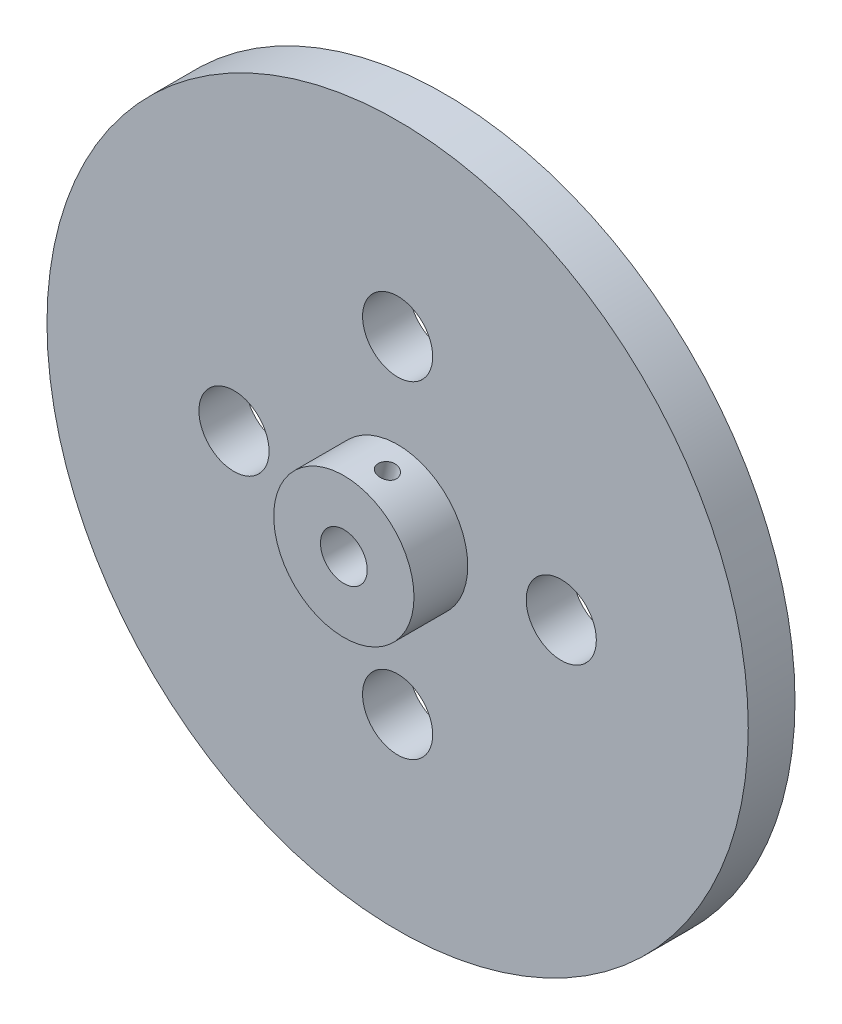
ISO-10303-21;
HEADER;
FILE_DESCRIPTION(('STEP AP214'),'2;1');
FILE_NAME('part.step','',(''),(''),'','','');
FILE_SCHEMA(('AUTOMOTIVE_DESIGN { 1 0 10303 214 1 1 1 1 }'));
ENDSEC;
DATA;
#1=APPLICATION_CONTEXT('core data for automotive mechanical design processes');
#2=APPLICATION_PROTOCOL_DEFINITION('international standard','automotive_design',2000,#1);
#3=PRODUCT_CONTEXT('',#1,'mechanical');
#4=PRODUCT('Part','Part','',(#3));
#5=PRODUCT_RELATED_PRODUCT_CATEGORY('part','',(#4));
#6=PRODUCT_DEFINITION_FORMATION('','',#4);
#7=PRODUCT_DEFINITION_CONTEXT('part definition',#1,'design');
#8=PRODUCT_DEFINITION('design','',#6,#7);
#9=PRODUCT_DEFINITION_SHAPE('','',#8);
#10=(LENGTH_UNIT() NAMED_UNIT(*) SI_UNIT(.MILLI.,.METRE.));
#11=(NAMED_UNIT(*) PLANE_ANGLE_UNIT() SI_UNIT($,.RADIAN.));
#12=(NAMED_UNIT(*) SI_UNIT($,.STERADIAN.) SOLID_ANGLE_UNIT());
#13=UNCERTAINTY_MEASURE_WITH_UNIT(LENGTH_MEASURE(1.E-05),#10,'distance_accuracy_value','');
#14=(GEOMETRIC_REPRESENTATION_CONTEXT(3) GLOBAL_UNCERTAINTY_ASSIGNED_CONTEXT((#13)) GLOBAL_UNIT_ASSIGNED_CONTEXT((#10,
#11,#12)) REPRESENTATION_CONTEXT('',''));
#15=CARTESIAN_POINT('',(0.,0.,0.));
#16=DIRECTION('',(0.,0.,1.));
#17=DIRECTION('',(1.,0.,0.));
#18=AXIS2_PLACEMENT_3D('',#15,#16,#17);
#19=CARTESIAN_POINT('',(0.,0.,4.3));
#20=DIRECTION('',(0.,0.,-1.));
#21=DIRECTION('',(-1.,0.,0.));
#22=AXIS2_PLACEMENT_3D('',#19,#20,#21);
#23=CYLINDRICAL_SURFACE('',#22,3.);
#24=CARTESIAN_POINT('',(0.,0.,4.3));
#25=DIRECTION('',(0.,0.,1.));
#26=DIRECTION('',(1.,0.,0.));
#27=AXIS2_PLACEMENT_3D('',#24,#25,#26);
#28=CIRCLE('',#27,3.);
#29=CARTESIAN_POINT('',(3.,0.,4.3));
#30=VERTEX_POINT('',#29);
#31=EDGE_CURVE('E54',#30,#30,#28,.T.);
#32=ORIENTED_EDGE('',*,*,#31,.F.);
#33=EDGE_LOOP('',(#32));
#34=FACE_BOUND('',#33,.T.);
#35=CARTESIAN_POINT('',(0.,0.,2.));
#36=DIRECTION('',(0.,0.,1.));
#37=DIRECTION('',(1.,0.,0.));
#38=AXIS2_PLACEMENT_3D('',#35,#36,#37);
#39=CIRCLE('',#38,3.);
#40=CARTESIAN_POINT('',(3.,0.,2.));
#41=VERTEX_POINT('',#40);
#42=EDGE_CURVE('E10',#41,#41,#39,.T.);
#43=ORIENTED_EDGE('',*,*,#42,.T.);
#44=EDGE_LOOP('',(#43));
#45=FACE_BOUND('',#44,.T.);
#46=CARTESIAN_POINT('',(0.274837500126044,2.98738419834551,3.10410851608453));
#47=CARTESIAN_POINT('',(0.274838495001766,2.98738431857046,3.12646927162154));
#48=CARTESIAN_POINT('',(0.276728231720396,2.98721211720762,3.14884369159291));
#49=CARTESIAN_POINT('',(0.284231644920791,2.98650732888726,3.19296894630521));
#50=CARTESIAN_POINT('',(0.289849131545114,2.98597437319066,3.21471911924776));
#51=CARTESIAN_POINT('',(0.30462469686335,2.98450306733387,3.25695068073917));
#52=CARTESIAN_POINT('',(0.313780274099827,2.9835650035333,3.27743295385966));
#53=CARTESIAN_POINT('',(0.33534531374031,2.98121797419978,3.31657057804334));
#54=CARTESIAN_POINT('',(0.347754254008821,2.97980908422024,3.33522622160486));
#55=CARTESIAN_POINT('',(0.375531796000134,2.97643614996329,3.37030303037371));
#56=CARTESIAN_POINT('',(0.390916794460664,2.97446900050268,3.38671091384227));
#57=CARTESIAN_POINT('',(0.4241447273516,2.96991277693803,3.4167115962104));
#58=CARTESIAN_POINT('',(0.441987787927559,2.96732367091066,3.43030425054523));
#59=CARTESIAN_POINT('',(0.479681122753813,2.96146426761484,3.45433674733003));
#60=CARTESIAN_POINT('',(0.499538719246613,2.95819143599825,3.46476449545324));
#61=CARTESIAN_POINT('',(0.540620759107893,2.9509597940632,3.48209366613321));
#62=CARTESIAN_POINT('',(0.561845145001931,2.94700101257758,3.48899523685927));
#63=CARTESIAN_POINT('',(0.604907841017836,2.93846307188835,3.49903626389411));
#64=CARTESIAN_POINT('',(0.626741747245814,2.93388774381207,3.50219785895761));
#65=CARTESIAN_POINT('',(0.670508711115998,2.92419566702246,3.50473783891274));
#66=CARTESIAN_POINT('',(0.692441764307756,2.91907894238447,3.50411639196289));
#67=CARTESIAN_POINT('',(0.735639534092964,2.90849206297003,3.49912558577645));
#68=CARTESIAN_POINT('',(0.756907609319339,2.90302435781855,3.49478004208421));
#69=CARTESIAN_POINT('',(0.798331341871795,2.89190720388002,3.482501671307));
#70=CARTESIAN_POINT('',(0.818486975621843,2.88625775124518,3.47456876822764));
#71=CARTESIAN_POINT('',(0.85720258179748,2.87499771207637,3.45531584844858));
#72=CARTESIAN_POINT('',(0.875757522221101,2.86938729568895,3.44398561810582));
#73=CARTESIAN_POINT('',(0.910717096525851,2.85848390021051,3.41826710504543));
#74=CARTESIAN_POINT('',(0.927121618213697,2.85319093768974,3.40387866287503));
#75=CARTESIAN_POINT('',(0.957475942757477,2.84314929593226,3.37231901674826));
#76=CARTESIAN_POINT('',(0.971405670053864,2.8384051681042,3.35512704806644));
#77=CARTESIAN_POINT('',(0.996289836778063,2.82976688228482,3.31851945020293));
#78=CARTESIAN_POINT('',(1.00724426439726,2.82587272766696,3.29910381219619));
#79=CARTESIAN_POINT('',(1.02589406501014,2.81915592895177,3.25858068491288));
#80=CARTESIAN_POINT('',(1.03358772345048,2.81633384864522,3.2374723124948));
#81=CARTESIAN_POINT('',(1.04549929221389,2.81193384063383,3.19417310690631));
#82=CARTESIAN_POINT('',(1.04971739401714,2.8103558443884,3.1719823334404));
#83=CARTESIAN_POINT('',(1.05454352858391,2.8085484943862,3.12733044803802));
#84=CARTESIAN_POINT('',(1.05517899697543,2.80830889141123,3.1048727141167));
#85=CARTESIAN_POINT('',(1.05289607538532,2.80916558475531,3.06016481741017));
#86=CARTESIAN_POINT('',(1.0499777718769,2.81026184856898,3.03791464958757));
#87=CARTESIAN_POINT('',(1.04068539954313,2.8137160591461,2.99434141153013));
#88=CARTESIAN_POINT('',(1.03432476007214,2.81606910245603,2.97301508409786));
#89=CARTESIAN_POINT('',(1.01832580427747,2.82189379749952,2.93179274855097));
#90=CARTESIAN_POINT('',(1.0086873579114,2.82536549361377,2.91189679722245));
#91=CARTESIAN_POINT('',(0.98631620438722,2.83325278164649,2.87396900793297));
#92=CARTESIAN_POINT('',(0.973565310201433,2.83767390240106,2.85594904863331));
#93=CARTESIAN_POINT('',(0.945328800241392,2.84720475885137,2.82240625052197));
#94=CARTESIAN_POINT('',(0.929843063110862,2.85231452510277,2.80688352258118));
#95=CARTESIAN_POINT('',(0.896426568626548,2.86299292396985,2.77867312207057));
#96=CARTESIAN_POINT('',(0.878480539766234,2.86856432912647,2.76600457806891));
#97=CARTESIAN_POINT('',(0.840696814628809,2.87986408430299,2.74399480202416));
#98=CARTESIAN_POINT('',(0.820859160923474,2.88559243078881,2.73465349512266));
#99=CARTESIAN_POINT('',(0.779893756589403,2.8969321133462,2.71959463506897));
#100=CARTESIAN_POINT('',(0.758770087647139,2.9025437508171,2.7138662115707));
#101=CARTESIAN_POINT('',(0.715769382898225,2.91344570497304,2.70616041451519));
#102=CARTESIAN_POINT('',(0.693892386046448,2.91873603823387,2.70418284729543));
#103=CARTESIAN_POINT('',(0.650182670241726,2.92878157801001,2.70403886282719));
#104=CARTESIAN_POINT('',(0.628350922716619,2.93354061492043,2.70584302032267));
#105=CARTESIAN_POINT('',(0.585188966198002,2.94245469975042,2.7131487131081));
#106=CARTESIAN_POINT('',(0.563858756505037,2.94660974851237,2.71865024324131));
#107=CARTESIAN_POINT('',(0.522323815544241,2.95425522366825,2.73318489163186));
#108=CARTESIAN_POINT('',(0.50211857720246,2.95774595124498,2.74221640380522));
#109=CARTESIAN_POINT('',(0.463402928150928,2.9640585223022,2.76355158119386));
#110=CARTESIAN_POINT('',(0.444892548751812,2.96688035342708,2.77585530684326));
#111=CARTESIAN_POINT('',(0.409968714722818,2.97190843260609,2.80349380592565));
#112=CARTESIAN_POINT('',(0.393571873613485,2.97410994790971,2.81885043463281));
#113=CARTESIAN_POINT('',(0.363517462632871,2.97793304061728,2.85211310957));
#114=CARTESIAN_POINT('',(0.349860540155619,2.97955448103056,2.87001975661907));
#115=CARTESIAN_POINT('',(0.325649003514998,2.98229815581555,2.90796531874285));
#116=CARTESIAN_POINT('',(0.31510828661522,2.98341816504477,2.92801325852776));
#117=CARTESIAN_POINT('',(0.297549667643133,2.98522072784145,2.96959825686309));
#118=CARTESIAN_POINT('',(0.290527988870154,2.98590375061011,2.99113369063052));
#119=CARTESIAN_POINT('',(0.281878500997562,2.98673002135392,3.02799823438774));
#120=CARTESIAN_POINT('',(0.279242281172791,2.98697621480973,3.04309622076588));
#121=CARTESIAN_POINT('',(0.275721448155329,2.98730326139661,3.07349684305782));
#122=CARTESIAN_POINT('',(0.274836818995606,2.98738411603486,3.08879947710484));
#123=CARTESIAN_POINT('',(0.274837500126044,2.98738419834551,3.10410851608453));
#124=B_SPLINE_CURVE_WITH_KNOTS('',3,(#46,#47,#48,#49,#50,#51,#52,#53,#54,#55,#56,#57,#58,#59,
#60,#61,#62,#63,#64,#65,#66,#67,#68,#69,#70,#71,#72,#73,#74,#75,#76,#77,#78,#79,#80,#81,#82,#83,
#84,#85,#86,#87,#88,#89,#90,#91,#92,#93,#94,#95,#96,#97,#98,#99,#100,#101,#102,#103,#104,#105,
#106,#107,#108,#109,#110,#111,#112,#113,#114,#115,#116,#117,#118,#119,#120,#121,#122,#123),
.UNSPECIFIED.,.T.,.F.,(4,2,2,2,2,2,2,2,2,2,2,2,2,2,2,2,2,2,2,2,2,2,2,2,2,2,2,2,2,2,2,2,2,2,2,2,
2,2,4),(0.,0.0670263311864479,0.134121275891152,0.201168870482634,0.268205711118416,
0.335622992879757,0.403043735725545,0.470718966154896,0.538391352649803,0.605661115904063,
0.672927888998098,0.73976767492078,0.806608876839184,0.873653078431973,0.940700776514915,
1.00826973227348,1.07583895620141,1.14344366492885,1.21104464883494,1.2781272372116,
1.34520819331388,1.4120293178671,1.47885309376396,1.54607710446041,1.61330409891368,
1.6809690621128,1.74863250284406,1.81609137604782,1.88354676615057,1.95047924099138,
2.01741162248135,2.084313586218,2.15121678564485,2.21861740036015,2.28603392193404,
2.35374671445572,2.42138667982278,2.46727591952048,2.51316474090222),.UNSPECIFIED.);
#125=CARTESIAN_POINT('',(0.274837500126044,2.98738419834551,3.10410851608453));
#126=VERTEX_POINT('',#125);
#127=EDGE_CURVE('E84',#126,#126,#124,.T.);
#128=ORIENTED_EDGE('',*,*,#127,.F.);
#129=EDGE_LOOP('',(#128));
#130=FACE_BOUND('',#129,.T.);
#131=ADVANCED_FACE('F33',(#34,#45,#130),#23,.T.);
#132=CARTESIAN_POINT('',(0.,0.,4.3));
#133=DIRECTION('',(0.,0.,-1.));
#134=DIRECTION('',(-1.,0.,0.));
#135=AXIS2_PLACEMENT_3D('',#132,#133,#134);
#136=CYLINDRICAL_SURFACE('',#135,1.);
#137=CARTESIAN_POINT('',(0.,0.,0.));
#138=DIRECTION('',(0.,0.,-1.));
#139=DIRECTION('',(-1.,0.,0.));
#140=AXIS2_PLACEMENT_3D('',#137,#138,#139);
#141=CIRCLE('',#140,1.);
#142=CARTESIAN_POINT('',(-1.,0.,0.));
#143=VERTEX_POINT('',#142);
#144=EDGE_CURVE('E70',#143,#143,#141,.T.);
#145=ORIENTED_EDGE('',*,*,#144,.T.);
#146=EDGE_LOOP('',(#145));
#147=FACE_BOUND('',#146,.T.);
#148=CARTESIAN_POINT('',(0.,0.,4.3));
#149=DIRECTION('',(0.,0.,1.));
#150=DIRECTION('',(1.,0.,0.));
#151=AXIS2_PLACEMENT_3D('',#148,#149,#150);
#152=CIRCLE('',#151,1.);
#153=CARTESIAN_POINT('',(1.,0.,4.3));
#154=VERTEX_POINT('',#153);
#155=EDGE_CURVE('E74',#154,#154,#152,.T.);
#156=ORIENTED_EDGE('',*,*,#155,.T.);
#157=EDGE_LOOP('',(#156));
#158=FACE_BOUND('',#157,.T.);
#159=CARTESIAN_POINT('',(-0.184990709021294,0.982740269641882,3.10410851608455));
#160=CARTESIAN_POINT('',(-0.184987935361249,0.982741854057648,3.12553627080821));
#161=CARTESIAN_POINT('',(-0.183132149886744,0.983095853569273,3.14699433254716));
#162=CARTESIAN_POINT('',(-0.175793203328884,0.984433710623713,3.18929489972652));
#163=CARTESIAN_POINT('',(-0.170300773200744,0.985419177436894,3.21013568969265));
#164=CARTESIAN_POINT('',(-0.155975230802417,0.987787343172318,3.25051807989286));
#165=CARTESIAN_POINT('',(-0.147154706761633,0.989168540598041,3.27006425341594));
#166=CARTESIAN_POINT('',(-0.126521200318671,0.992018350768538,3.30748407915222));
#167=CARTESIAN_POINT('',(-0.114708871257899,0.993486944374497,3.32535809536064));
#168=CARTESIAN_POINT('',(-0.0877783198025355,0.99623649540206,3.35995889921646));
#169=CARTESIAN_POINT('',(-0.0725204070122077,0.997503769747266,3.37657809771683));
#170=CARTESIAN_POINT('',(-0.0395380501866295,0.999354488122954,3.40721263816752));
#171=CARTESIAN_POINT('',(-0.0218127478446339,0.999937693524704,3.4212270700444));
#172=CARTESIAN_POINT('',(0.0163740525533167,1.00005503632617,3.44678838874901));
#173=CARTESIAN_POINT('',(0.0369158965412317,0.999546889399632,3.45821614976023));
#174=CARTESIAN_POINT('',(0.0795395727532451,0.997059763034562,3.47747635309696));
#175=CARTESIAN_POINT('',(0.101620774145325,0.995081382927191,3.48531025833088));
#176=CARTESIAN_POINT('',(0.14551190513408,0.989591548730302,3.49677642136666));
#177=CARTESIAN_POINT('',(0.167283216556137,0.986158949475696,3.50059372660354));
#178=CARTESIAN_POINT('',(0.210863066977665,0.977767064600196,3.50451417751814));
#179=CARTESIAN_POINT('',(0.232671589052697,0.972808349183468,3.50461870870779));
#180=CARTESIAN_POINT('',(0.274411336199933,0.961841070179684,3.50121208383571));
#181=CARTESIAN_POINT('',(0.294379197925819,0.95590713211488,3.49790371458665));
#182=CARTESIAN_POINT('',(0.333193273697815,0.943080175091667,3.48811011621047));
#183=CARTESIAN_POINT('',(0.352039405365839,0.936187085818477,3.4816246540847));
#184=CARTESIAN_POINT('',(0.388452782588065,0.921680352029893,3.46558138963135));
#185=CARTESIAN_POINT('',(0.405996488165083,0.914057417779593,3.45597878009007));
#186=CARTESIAN_POINT('',(0.439157346210477,0.898596712661785,3.43401579721299));
#187=CARTESIAN_POINT('',(0.454773835574094,0.890758868976951,3.42165447876322));
#188=CARTESIAN_POINT('',(0.484785982105319,0.874808612329707,3.39357915523981));
#189=CARTESIAN_POINT('',(0.499034184338907,0.866711954725557,3.37769832185168));
#190=CARTESIAN_POINT('',(0.52482113037454,0.851345173247628,3.34351125791414));
#191=CARTESIAN_POINT('',(0.536358987447143,0.844075320275355,3.32520423665705));
#192=CARTESIAN_POINT('',(0.556784799881261,0.830749089204261,3.28602600950634));
#193=CARTESIAN_POINT('',(0.565588687878934,0.824732793424721,3.2650969756785));
#194=CARTESIAN_POINT('',(0.579850650057289,0.814769790826552,3.22166712484118));
#195=CARTESIAN_POINT('',(0.585310896963322,0.810821740286824,3.19916733913222));
#196=CARTESIAN_POINT('',(0.592476046016447,0.805599607704345,3.15470328124947));
#197=CARTESIAN_POINT('',(0.5943899601537,0.804176924351288,3.13279024596699));
#198=CARTESIAN_POINT('',(0.595037369484355,0.803698265886336,3.08889467349291));
#199=CARTESIAN_POINT('',(0.593771829076679,0.804641573116997,3.06691215939584));
#200=CARTESIAN_POINT('',(0.588272030029154,0.808669444340456,3.02481783146513));
#201=CARTESIAN_POINT('',(0.584210943790723,0.811629004786697,3.00467077706581));
#202=CARTESIAN_POINT('',(0.57342379963801,0.819285401660845,2.96545117772027));
#203=CARTESIAN_POINT('',(0.566697150849762,0.823982623259909,2.94637887208448));
#204=CARTESIAN_POINT('',(0.550410366794754,0.834954058192824,2.90898774133453));
#205=CARTESIAN_POINT('',(0.540746398954845,0.841284492453221,2.89073082581231));
#206=CARTESIAN_POINT('',(0.518886328174449,0.854940281396957,2.85621119315837));
#207=CARTESIAN_POINT('',(0.506689194018965,0.862266040841342,2.83994929246995));
#208=CARTESIAN_POINT('',(0.47896430877838,0.877989225759496,2.80863292922356));
#209=CARTESIAN_POINT('',(0.46325710486448,0.886425840325048,2.79375634384069));
#210=CARTESIAN_POINT('',(0.429417516902653,0.903303753669263,2.76707234831368));
#211=CARTESIAN_POINT('',(0.41128503433392,0.911745052624338,2.75526506290947));
#212=CARTESIAN_POINT('',(0.372966735465926,0.92807808068549,2.73509850106378));
#213=CARTESIAN_POINT('',(0.352781425256126,0.935969944441079,2.72673837734017));
#214=CARTESIAN_POINT('',(0.31087783510705,0.950708721228496,2.71379857369474));
#215=CARTESIAN_POINT('',(0.289160394039632,0.957556199686702,2.7092168422013));
#216=CARTESIAN_POINT('',(0.246313829790671,0.96942837244768,2.7042075656444));
#217=CARTESIAN_POINT('',(0.225238762181154,0.97454284155285,2.70352849867494));
#218=CARTESIAN_POINT('',(0.18297443921827,0.983354495459621,2.70567960186576));
#219=CARTESIAN_POINT('',(0.161785201627852,0.987051894625037,2.70850924098053));
#220=CARTESIAN_POINT('',(0.120585524593837,0.992914558011096,2.71741772471256));
#221=CARTESIAN_POINT('',(0.100558867913553,0.995123387037554,2.72339411765286));
#222=CARTESIAN_POINT('',(0.0615440405822425,0.998296450135571,2.73831879388224));
#223=CARTESIAN_POINT('',(0.0425560622462377,0.999260454465308,2.74726762537432));
#224=CARTESIAN_POINT('',(0.00528202579301713,1.00016751003115,2.76832874954254));
#225=CARTESIAN_POINT('',(-0.0129359191654652,1.00006355525673,2.78056337704373));
#226=CARTESIAN_POINT('',(-0.0472730677954621,0.999029958894157,2.80766585914847));
#227=CARTESIAN_POINT('',(-0.0633913978913881,0.998099974874637,2.82253480376454));
#228=CARTESIAN_POINT('',(-0.0940319616971032,0.995695089111497,2.85557134752054));
#229=CARTESIAN_POINT('',(-0.10839361041617,0.994190017009809,2.87388617252784));
#230=CARTESIAN_POINT('',(-0.133797219361352,0.991091726826194,2.91269706289033));
#231=CARTESIAN_POINT('',(-0.144838789619193,0.989498498415645,2.9331933840962));
#232=CARTESIAN_POINT('',(-0.162312784202507,0.986775413062103,2.97391618955816));
#233=CARTESIAN_POINT('',(-0.169070088854901,0.985616791957898,2.99400159774269));
#234=CARTESIAN_POINT('',(-0.179140855662949,0.983837226890377,3.03500524103159));
#235=CARTESIAN_POINT('',(-0.182463914008976,0.983214785515184,3.05592098497224));
#236=CARTESIAN_POINT('',(-0.184661405787327,0.982802003917025,3.08598353063438));
#237=CARTESIAN_POINT('',(-0.18499188244319,0.982739599340503,3.09504331120083));
#238=CARTESIAN_POINT('',(-0.184990709021294,0.982740269641882,3.10410851608455));
#239=B_SPLINE_CURVE_WITH_KNOTS('',3,(#159,#160,#161,#162,#163,#164,#165,#166,#167,#168,#169,
#170,#171,#172,#173,#174,#175,#176,#177,#178,#179,#180,#181,#182,#183,#184,#185,#186,#187,#188,
#189,#190,#191,#192,#193,#194,#195,#196,#197,#198,#199,#200,#201,#202,#203,#204,#205,#206,#207,
#208,#209,#210,#211,#212,#213,#214,#215,#216,#217,#218,#219,#220,#221,#222,#223,#224,#225,#226,
#227,#228,#229,#230,#231,#232,#233,#234,#235,#236,#237,#238),.UNSPECIFIED.,.T.,.F.,(4,2,2,2,2,2,
2,2,2,2,2,2,2,2,2,2,2,2,2,2,2,2,2,2,2,2,2,2,2,2,2,2,2,2,2,2,2,2,2,4),(0.,0.0642550938010453,
0.128674594065437,0.192852836761695,0.257017076471495,0.324509353173155,0.392025166699928,
0.462203921074364,0.532354083209466,0.59910818105616,0.665837367725935,0.728817941551274,
0.791803134878282,0.855737075606177,0.919692953361445,0.987847562673113,1.05602443881308,
1.12612730570441,1.19618457070537,1.26196259191668,1.32772066360757,1.38973382647218,
1.45176074346124,1.516302725652,1.58087103362252,1.65020803938548,1.71954786264466,
1.7888706326091,1.85815573722965,1.92292060734377,1.98767567643883,2.05044211865345,
2.11322014323533,2.17877276163609,2.24435256763904,2.31399226519811,2.38364013927294,
2.44703313864713,2.51024851834394,2.53743221526604),.UNSPECIFIED.);
#240=CARTESIAN_POINT('',(-0.184990709021294,0.982740269641882,3.10410851608455));
#241=VERTEX_POINT('',#240);
#242=EDGE_CURVE('E37',#241,#241,#239,.T.);
#243=ORIENTED_EDGE('',*,*,#242,.T.);
#244=EDGE_LOOP('',(#243));
#245=FACE_BOUND('',#244,.T.);
#246=ADVANCED_FACE('F122',(#147,#158,#245),#136,.F.);
#247=CARTESIAN_POINT('',(0.,0.,2.));
#248=DIRECTION('',(0.,0.,-1.));
#249=DIRECTION('',(-1.,0.,0.));
#250=AXIS2_PLACEMENT_3D('',#247,#248,#249);
#251=CYLINDRICAL_SURFACE('',#250,15.);
#252=CARTESIAN_POINT('',(0.,0.,2.));
#253=DIRECTION('',(0.,0.,1.));
#254=DIRECTION('',(1.,0.,0.));
#255=AXIS2_PLACEMENT_3D('',#252,#253,#254);
#256=CIRCLE('',#255,15.);
#257=CARTESIAN_POINT('',(15.,0.,2.));
#258=VERTEX_POINT('',#257);
#259=EDGE_CURVE('E46',#258,#258,#256,.T.);
#260=ORIENTED_EDGE('',*,*,#259,.F.);
#261=EDGE_LOOP('',(#260));
#262=FACE_BOUND('',#261,.T.);
#263=CARTESIAN_POINT('',(0.,0.,0.));
#264=DIRECTION('',(0.,0.,1.));
#265=DIRECTION('',(1.,0.,0.));
#266=AXIS2_PLACEMENT_3D('',#263,#264,#265);
#267=CIRCLE('',#266,15.);
#268=CARTESIAN_POINT('',(15.,0.,0.));
#269=VERTEX_POINT('',#268);
#270=EDGE_CURVE('E51',#269,#269,#267,.T.);
#271=ORIENTED_EDGE('',*,*,#270,.T.);
#272=EDGE_LOOP('',(#271));
#273=FACE_BOUND('',#272,.T.);
#274=ADVANCED_FACE('F35',(#262,#273),#251,.T.);
#275=CARTESIAN_POINT('',(0.,0.,2.));
#276=DIRECTION('',(0.,0.,1.));
#277=DIRECTION('',(1.,0.,0.));
#278=AXIS2_PLACEMENT_3D('',#275,#276,#277);
#279=PLANE('',#278);
#280=CARTESIAN_POINT('',(0.,7.,2.));
#281=DIRECTION('',(0.,0.,1.));
#282=DIRECTION('',(1.,0.,0.));
#283=AXIS2_PLACEMENT_3D('',#280,#281,#282);
#284=CIRCLE('',#283,1.5);
#285=CARTESIAN_POINT('',(1.5,7.,2.));
#286=VERTEX_POINT('',#285);
#287=EDGE_CURVE('E63',#286,#286,#284,.T.);
#288=ORIENTED_EDGE('',*,*,#287,.F.);
#289=EDGE_LOOP('',(#288));
#290=FACE_BOUND('',#289,.T.);
#291=CARTESIAN_POINT('',(-6.9999999999998,-1.98951966012828E-13,2.));
#292=DIRECTION('',(0.,0.,1.));
#293=DIRECTION('',(1.,0.,0.));
#294=AXIS2_PLACEMENT_3D('',#291,#292,#293);
#295=CIRCLE('',#294,1.5);
#296=CARTESIAN_POINT('',(-5.4999999999998,-1.98951966012828E-13,2.));
#297=VERTEX_POINT('',#296);
#298=EDGE_CURVE('E87',#297,#297,#295,.T.);
#299=ORIENTED_EDGE('',*,*,#298,.F.);
#300=EDGE_LOOP('',(#299));
#301=FACE_BOUND('',#300,.T.);
#302=CARTESIAN_POINT('',(7.0000000000002,1.98094713253425E-13,2.));
#303=DIRECTION('',(0.,0.,1.));
#304=DIRECTION('',(1.,0.,0.));
#305=AXIS2_PLACEMENT_3D('',#302,#303,#304);
#306=CIRCLE('',#305,1.5);
#307=CARTESIAN_POINT('',(8.5000000000002,1.98094713253425E-13,2.));
#308=VERTEX_POINT('',#307);
#309=EDGE_CURVE('E83',#308,#308,#306,.T.);
#310=ORIENTED_EDGE('',*,*,#309,.F.);
#311=EDGE_LOOP('',(#310));
#312=FACE_BOUND('',#311,.T.);
#313=CARTESIAN_POINT('',(3.9618942650685E-13,-7.,2.));
#314=DIRECTION('',(0.,0.,1.));
#315=DIRECTION('',(1.,0.,0.));
#316=AXIS2_PLACEMENT_3D('',#313,#314,#315);
#317=CIRCLE('',#316,1.5);
#318=CARTESIAN_POINT('',(1.5000000000004,-7.,2.));
#319=VERTEX_POINT('',#318);
#320=EDGE_CURVE('E80',#319,#319,#317,.T.);
#321=ORIENTED_EDGE('',*,*,#320,.F.);
#322=EDGE_LOOP('',(#321));
#323=FACE_BOUND('',#322,.T.);
#324=ORIENTED_EDGE('',*,*,#42,.F.);
#325=EDGE_LOOP('',(#324));
#326=FACE_BOUND('',#325,.T.);
#327=ORIENTED_EDGE('',*,*,#259,.T.);
#328=EDGE_LOOP('',(#327));
#329=FACE_BOUND('',#328,.T.);
#330=ADVANCED_FACE('F131',(#290,#301,#312,#323,#326,#329),#279,.T.);
#331=CARTESIAN_POINT('',(0.,0.,0.));
#332=DIRECTION('',(0.,0.,1.));
#333=DIRECTION('',(1.,0.,0.));
#334=AXIS2_PLACEMENT_3D('',#331,#332,#333);
#335=PLANE('',#334);
#336=CARTESIAN_POINT('',(0.,7.,0.));
#337=DIRECTION('',(0.,0.,1.));
#338=DIRECTION('',(1.,0.,0.));
#339=AXIS2_PLACEMENT_3D('',#336,#337,#338);
#340=CIRCLE('',#339,1.5);
#341=CARTESIAN_POINT('',(1.5,7.,0.));
#342=VERTEX_POINT('',#341);
#343=EDGE_CURVE('E68',#342,#342,#340,.T.);
#344=ORIENTED_EDGE('',*,*,#343,.T.);
#345=EDGE_LOOP('',(#344));
#346=FACE_BOUND('',#345,.T.);
#347=CARTESIAN_POINT('',(-6.9999999999998,-1.98951966012828E-13,0.));
#348=DIRECTION('',(0.,0.,1.));
#349=DIRECTION('',(1.,0.,0.));
#350=AXIS2_PLACEMENT_3D('',#347,#348,#349);
#351=CIRCLE('',#350,1.5);
#352=CARTESIAN_POINT('',(-5.4999999999998,-1.98951966012828E-13,0.));
#353=VERTEX_POINT('',#352);
#354=EDGE_CURVE('E66',#353,#353,#351,.T.);
#355=ORIENTED_EDGE('',*,*,#354,.T.);
#356=EDGE_LOOP('',(#355));
#357=FACE_BOUND('',#356,.T.);
#358=CARTESIAN_POINT('',(7.0000000000002,1.98094713253425E-13,0.));
#359=DIRECTION('',(0.,0.,1.));
#360=DIRECTION('',(1.,0.,0.));
#361=AXIS2_PLACEMENT_3D('',#358,#359,#360);
#362=CIRCLE('',#361,1.5);
#363=CARTESIAN_POINT('',(8.5000000000002,1.98094713253425E-13,0.));
#364=VERTEX_POINT('',#363);
#365=EDGE_CURVE('E62',#364,#364,#362,.T.);
#366=ORIENTED_EDGE('',*,*,#365,.T.);
#367=EDGE_LOOP('',(#366));
#368=FACE_BOUND('',#367,.T.);
#369=CARTESIAN_POINT('',(3.9618942650685E-13,-7.,0.));
#370=DIRECTION('',(0.,0.,1.));
#371=DIRECTION('',(1.,0.,0.));
#372=AXIS2_PLACEMENT_3D('',#369,#370,#371);
#373=CIRCLE('',#372,1.5);
#374=CARTESIAN_POINT('',(1.5000000000004,-7.,0.));
#375=VERTEX_POINT('',#374);
#376=EDGE_CURVE('E59',#375,#375,#373,.T.);
#377=ORIENTED_EDGE('',*,*,#376,.T.);
#378=EDGE_LOOP('',(#377));
#379=FACE_BOUND('',#378,.T.);
#380=ORIENTED_EDGE('',*,*,#144,.F.);
#381=EDGE_LOOP('',(#380));
#382=FACE_BOUND('',#381,.T.);
#383=ORIENTED_EDGE('',*,*,#270,.F.);
#384=EDGE_LOOP('',(#383));
#385=FACE_BOUND('',#384,.T.);
#386=ADVANCED_FACE('F126',(#346,#357,#368,#379,#382,#385),#335,.F.);
#387=CARTESIAN_POINT('',(0.,0.,4.3));
#388=DIRECTION('',(0.,0.,1.));
#389=DIRECTION('',(1.,0.,0.));
#390=AXIS2_PLACEMENT_3D('',#387,#388,#389);
#391=PLANE('',#390);
#392=ORIENTED_EDGE('',*,*,#31,.T.);
#393=EDGE_LOOP('',(#392));
#394=FACE_BOUND('',#393,.T.);
#395=ORIENTED_EDGE('',*,*,#155,.F.);
#396=EDGE_LOOP('',(#395));
#397=FACE_BOUND('',#396,.T.);
#398=ADVANCED_FACE('F120',(#394,#397),#391,.T.);
#399=CARTESIAN_POINT('',(3.9618942650685E-13,-7.,-8.));
#400=DIRECTION('',(0.,0.,1.));
#401=DIRECTION('',(1.,0.,0.));
#402=AXIS2_PLACEMENT_3D('',#399,#400,#401);
#403=CYLINDRICAL_SURFACE('',#402,1.5);
#404=ORIENTED_EDGE('',*,*,#320,.T.);
#405=EDGE_LOOP('',(#404));
#406=FACE_BOUND('',#405,.T.);
#407=ORIENTED_EDGE('',*,*,#376,.F.);
#408=EDGE_LOOP('',(#407));
#409=FACE_BOUND('',#408,.T.);
#410=ADVANCED_FACE('F117',(#406,#409),#403,.F.);
#411=CARTESIAN_POINT('',(7.0000000000002,1.98094713253425E-13,-8.));
#412=DIRECTION('',(0.,0.,1.));
#413=DIRECTION('',(1.,0.,0.));
#414=AXIS2_PLACEMENT_3D('',#411,#412,#413);
#415=CYLINDRICAL_SURFACE('',#414,1.5);
#416=ORIENTED_EDGE('',*,*,#309,.T.);
#417=EDGE_LOOP('',(#416));
#418=FACE_BOUND('',#417,.T.);
#419=ORIENTED_EDGE('',*,*,#365,.F.);
#420=EDGE_LOOP('',(#419));
#421=FACE_BOUND('',#420,.T.);
#422=ADVANCED_FACE('F113',(#418,#421),#415,.F.);
#423=CARTESIAN_POINT('',(-6.9999999999998,-1.98951966012828E-13,-8.));
#424=DIRECTION('',(0.,0.,1.));
#425=DIRECTION('',(1.,0.,0.));
#426=AXIS2_PLACEMENT_3D('',#423,#424,#425);
#427=CYLINDRICAL_SURFACE('',#426,1.5);
#428=ORIENTED_EDGE('',*,*,#298,.T.);
#429=EDGE_LOOP('',(#428));
#430=FACE_BOUND('',#429,.T.);
#431=ORIENTED_EDGE('',*,*,#354,.F.);
#432=EDGE_LOOP('',(#431));
#433=FACE_BOUND('',#432,.T.);
#434=ADVANCED_FACE('F109',(#430,#433),#427,.F.);
#435=CARTESIAN_POINT('',(0.,7.,-8.));
#436=DIRECTION('',(0.,0.,1.));
#437=DIRECTION('',(1.,0.,0.));
#438=AXIS2_PLACEMENT_3D('',#435,#436,#437);
#439=CYLINDRICAL_SURFACE('',#438,1.5);
#440=ORIENTED_EDGE('',*,*,#287,.T.);
#441=EDGE_LOOP('',(#440));
#442=FACE_BOUND('',#441,.T.);
#443=ORIENTED_EDGE('',*,*,#343,.F.);
#444=EDGE_LOOP('',(#443));
#445=FACE_BOUND('',#444,.T.);
#446=ADVANCED_FACE('F104',(#442,#445),#439,.F.);
#447=CARTESIAN_POINT('',(-0.00150556489966947,-0.00645521873162856,3.10410851608456));
#448=DIRECTION('',(0.223575088450814,0.974686708550091,0.));
#449=DIRECTION('',(-0.974686708550091,0.223575088450814,0.));
#450=AXIS2_PLACEMENT_3D('',#447,#448,#449);
#451=CYLINDRICAL_SURFACE('',#450,0.399999999999999);
#452=ORIENTED_EDGE('',*,*,#242,.F.);
#453=EDGE_LOOP('',(#452));
#454=FACE_BOUND('',#453,.T.);
#455=ORIENTED_EDGE('',*,*,#127,.T.);
#456=EDGE_LOOP('',(#455));
#457=FACE_BOUND('',#456,.T.);
#458=ADVANCED_FACE('F100',(#454,#457),#451,.F.);
#459=CLOSED_SHELL('',(#131,#246,#274,#330,#386,#398,#410,#422,#434,#446,#458));
#460=MANIFOLD_SOLID_BREP('B2',#459);
#461=ADVANCED_BREP_SHAPE_REPRESENTATION('',(#18,#460),#14);
#462=SHAPE_DEFINITION_REPRESENTATION(#9,#461);
ENDSEC;
END-ISO-10303-21;
